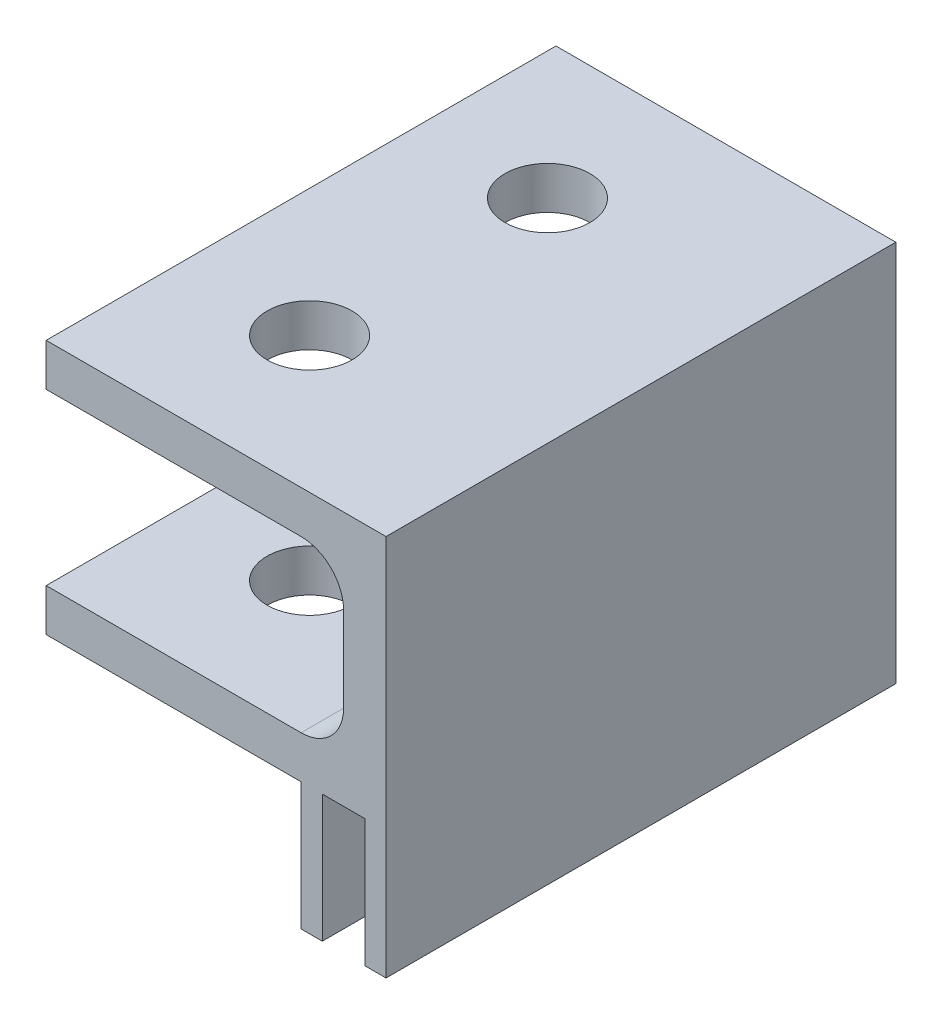
ISO-10303-21;
HEADER;
FILE_DESCRIPTION(('STEP AP214'),'2;1');
FILE_NAME('part.step','',(''),(''),'','','');
FILE_SCHEMA(('AUTOMOTIVE_DESIGN { 1 0 10303 214 1 1 1 1 }'));
ENDSEC;
DATA;
#1=APPLICATION_CONTEXT('core data for automotive mechanical design processes');
#2=APPLICATION_PROTOCOL_DEFINITION('international standard','automotive_design',2000,#1);
#3=PRODUCT_CONTEXT('',#1,'mechanical');
#4=PRODUCT('Part','Part','',(#3));
#5=PRODUCT_RELATED_PRODUCT_CATEGORY('part','',(#4));
#6=PRODUCT_DEFINITION_FORMATION('','',#4);
#7=PRODUCT_DEFINITION_CONTEXT('part definition',#1,'design');
#8=PRODUCT_DEFINITION('design','',#6,#7);
#9=PRODUCT_DEFINITION_SHAPE('','',#8);
#10=(LENGTH_UNIT() NAMED_UNIT(*) SI_UNIT(.MILLI.,.METRE.));
#11=(NAMED_UNIT(*) PLANE_ANGLE_UNIT() SI_UNIT($,.RADIAN.));
#12=(NAMED_UNIT(*) SI_UNIT($,.STERADIAN.) SOLID_ANGLE_UNIT());
#13=UNCERTAINTY_MEASURE_WITH_UNIT(LENGTH_MEASURE(1.E-05),#10,'distance_accuracy_value','');
#14=(GEOMETRIC_REPRESENTATION_CONTEXT(3) GLOBAL_UNCERTAINTY_ASSIGNED_CONTEXT((#13)) GLOBAL_UNIT_ASSIGNED_CONTEXT((#10,
#11,#12)) REPRESENTATION_CONTEXT('',''));
#15=CARTESIAN_POINT('',(0.,0.,0.));
#16=DIRECTION('',(0.,0.,1.));
#17=DIRECTION('',(1.,0.,0.));
#18=AXIS2_PLACEMENT_3D('',#15,#16,#17);
#19=CARTESIAN_POINT('',(0.,-25.,60.));
#20=DIRECTION('',(0.,1.,0.));
#21=DIRECTION('',(0.,0.,1.));
#22=AXIS2_PLACEMENT_3D('',#19,#20,#21);
#23=PLANE('',#22);
#24=DIRECTION('',(1.,0.,0.));
#25=VECTOR('',#24,1.);
#26=CARTESIAN_POINT('',(0.,-25.,0.));
#27=LINE('',#26,#25);
#28=CARTESIAN_POINT('',(32.5,-25.,0.));
#29=VERTEX_POINT('',#28);
#30=CARTESIAN_POINT('',(37.5,-25.,0.));
#31=VERTEX_POINT('',#30);
#32=EDGE_CURVE('E55',#29,#31,#27,.T.);
#33=ORIENTED_EDGE('',*,*,#32,.T.);
#34=DIRECTION('',(0.,0.,1.));
#35=VECTOR('',#34,1.);
#36=CARTESIAN_POINT('',(37.5,-25.,0.));
#37=LINE('',#36,#35);
#38=CARTESIAN_POINT('',(37.5,-25.,60.));
#39=VERTEX_POINT('',#38);
#40=EDGE_CURVE('E50',#31,#39,#37,.T.);
#41=ORIENTED_EDGE('',*,*,#40,.T.);
#42=DIRECTION('',(1.,0.,0.));
#43=VECTOR('',#42,1.);
#44=CARTESIAN_POINT('',(0.,-25.,60.));
#45=LINE('',#44,#43);
#46=CARTESIAN_POINT('',(32.5,-25.,60.));
#47=VERTEX_POINT('',#46);
#48=EDGE_CURVE('E240',#47,#39,#45,.T.);
#49=ORIENTED_EDGE('',*,*,#48,.F.);
#50=DIRECTION('',(0.,0.,1.));
#51=VECTOR('',#50,1.);
#52=CARTESIAN_POINT('',(32.5,-25.,0.));
#53=LINE('',#52,#51);
#54=EDGE_CURVE('E180',#29,#47,#53,.T.);
#55=ORIENTED_EDGE('',*,*,#54,.F.);
#56=EDGE_LOOP('',(#33,#41,#49,#55));
#57=FACE_BOUND('',#56,.T.);
#58=ADVANCED_FACE('F35',(#57),#23,.F.);
#59=CARTESIAN_POINT('',(0.,0.,60.));
#60=DIRECTION('',(0.,1.,0.));
#61=DIRECTION('',(0.,0.,1.));
#62=AXIS2_PLACEMENT_3D('',#59,#60,#61);
#63=PLANE('',#62);
#64=DIRECTION('',(1.,0.,0.));
#65=VECTOR('',#64,1.);
#66=CARTESIAN_POINT('',(0.,0.,0.));
#67=LINE('',#66,#65);
#68=CARTESIAN_POINT('',(0.,0.,0.));
#69=VERTEX_POINT('',#68);
#70=CARTESIAN_POINT('',(30.,0.,0.));
#71=VERTEX_POINT('',#70);
#72=EDGE_CURVE('E251',#69,#71,#67,.T.);
#73=ORIENTED_EDGE('',*,*,#72,.T.);
#74=DIRECTION('',(0.,0.,-1.));
#75=VECTOR('',#74,1.);
#76=CARTESIAN_POINT('',(30.,0.,60.));
#77=LINE('',#76,#75);
#78=CARTESIAN_POINT('',(30.,0.,60.));
#79=VERTEX_POINT('',#78);
#80=EDGE_CURVE('E287',#71,#79,#77,.F.);
#81=ORIENTED_EDGE('',*,*,#80,.T.);
#82=DIRECTION('',(1.,0.,0.));
#83=VECTOR('',#82,1.);
#84=CARTESIAN_POINT('',(0.,0.,60.));
#85=LINE('',#84,#83);
#86=CARTESIAN_POINT('',(0.,0.,60.));
#87=VERTEX_POINT('',#86);
#88=EDGE_CURVE('E229',#87,#79,#85,.T.);
#89=ORIENTED_EDGE('',*,*,#88,.F.);
#90=DIRECTION('',(0.,0.,-1.));
#91=VECTOR('',#90,1.);
#92=CARTESIAN_POINT('',(0.,0.,60.));
#93=LINE('',#92,#91);
#94=EDGE_CURVE('E276',#87,#69,#93,.T.);
#95=ORIENTED_EDGE('',*,*,#94,.T.);
#96=EDGE_LOOP('',(#73,#81,#89,#95));
#97=FACE_BOUND('',#96,.T.);
#98=CARTESIAN_POINT('',(15.,0.,16.));
#99=DIRECTION('',(0.,1.,0.));
#100=DIRECTION('',(0.,0.,1.));
#101=AXIS2_PLACEMENT_3D('',#98,#99,#100);
#102=CIRCLE('',#101,5.);
#103=CARTESIAN_POINT('',(15.,0.,21.));
#104=VERTEX_POINT('',#103);
#105=EDGE_CURVE('E213',#104,#104,#102,.F.);
#106=ORIENTED_EDGE('',*,*,#105,.F.);
#107=EDGE_LOOP('',(#106));
#108=FACE_BOUND('',#107,.T.);
#109=CARTESIAN_POINT('',(15.,0.,44.));
#110=DIRECTION('',(0.,1.,0.));
#111=DIRECTION('',(0.,0.,1.));
#112=AXIS2_PLACEMENT_3D('',#109,#110,#111);
#113=CIRCLE('',#112,5.);
#114=CARTESIAN_POINT('',(15.,0.,49.));
#115=VERTEX_POINT('',#114);
#116=EDGE_CURVE('E222',#115,#115,#113,.T.);
#117=ORIENTED_EDGE('',*,*,#116,.T.);
#118=EDGE_LOOP('',(#117));
#119=FACE_BOUND('',#118,.T.);
#120=ADVANCED_FACE('F297',(#97,#108,#119),#63,.F.);
#121=CARTESIAN_POINT('',(35.,-20.,60.));
#122=DIRECTION('',(0.,-1.,0.));
#123=DIRECTION('',(1.,0.,0.));
#124=AXIS2_PLACEMENT_3D('',#121,#122,#123);
#125=PLANE('',#124);
#126=DIRECTION('',(-1.,0.,0.));
#127=VECTOR('',#126,1.);
#128=CARTESIAN_POINT('',(35.,-20.,60.));
#129=LINE('',#128,#127);
#130=CARTESIAN_POINT('',(30.,-20.,60.));
#131=VERTEX_POINT('',#130);
#132=CARTESIAN_POINT('',(0.,-20.,60.));
#133=VERTEX_POINT('',#132);
#134=EDGE_CURVE('E236',#131,#133,#129,.T.);
#135=ORIENTED_EDGE('',*,*,#134,.F.);
#136=DIRECTION('',(0.,0.,-1.));
#137=VECTOR('',#136,1.);
#138=CARTESIAN_POINT('',(30.,-20.,0.));
#139=LINE('',#138,#137);
#140=CARTESIAN_POINT('',(30.,-20.,0.));
#141=VERTEX_POINT('',#140);
#142=EDGE_CURVE('E279',#131,#141,#139,.T.);
#143=ORIENTED_EDGE('',*,*,#142,.T.);
#144=DIRECTION('',(-1.,0.,0.));
#145=VECTOR('',#144,1.);
#146=CARTESIAN_POINT('',(35.,-20.,0.));
#147=LINE('',#146,#145);
#148=CARTESIAN_POINT('',(0.,-20.,0.));
#149=VERTEX_POINT('',#148);
#150=EDGE_CURVE('E257',#141,#149,#147,.T.);
#151=ORIENTED_EDGE('',*,*,#150,.T.);
#152=DIRECTION('',(0.,0.,-1.));
#153=VECTOR('',#152,1.);
#154=CARTESIAN_POINT('',(0.,-20.,60.));
#155=LINE('',#154,#153);
#156=EDGE_CURVE('E273',#133,#149,#155,.T.);
#157=ORIENTED_EDGE('',*,*,#156,.F.);
#158=EDGE_LOOP('',(#135,#143,#151,#157));
#159=FACE_BOUND('',#158,.T.);
#160=CARTESIAN_POINT('',(15.,-20.,16.));
#161=DIRECTION('',(0.,-1.,0.));
#162=DIRECTION('',(1.,0.,0.));
#163=AXIS2_PLACEMENT_3D('',#160,#161,#162);
#164=CIRCLE('',#163,5.);
#165=CARTESIAN_POINT('',(20.,-20.,16.));
#166=VERTEX_POINT('',#165);
#167=EDGE_CURVE('E210',#166,#166,#164,.F.);
#168=ORIENTED_EDGE('',*,*,#167,.F.);
#169=EDGE_LOOP('',(#168));
#170=FACE_BOUND('',#169,.T.);
#171=CARTESIAN_POINT('',(15.,-20.,44.));
#172=DIRECTION('',(0.,-1.,0.));
#173=DIRECTION('',(1.,0.,0.));
#174=AXIS2_PLACEMENT_3D('',#171,#172,#173);
#175=CIRCLE('',#174,5.);
#176=CARTESIAN_POINT('',(20.,-20.,44.));
#177=VERTEX_POINT('',#176);
#178=EDGE_CURVE('E219',#177,#177,#175,.T.);
#179=ORIENTED_EDGE('',*,*,#178,.T.);
#180=EDGE_LOOP('',(#179));
#181=FACE_BOUND('',#180,.T.);
#182=ADVANCED_FACE('F314',(#159,#170,#181),#125,.F.);
#183=CARTESIAN_POINT('',(0.,-25.,0.));
#184=VERTEX_POINT('',#183);
#185=CARTESIAN_POINT('',(30.,-25.,0.));
#186=VERTEX_POINT('',#185);
#187=EDGE_CURVE('E261',#184,#186,#27,.T.);
#188=ORIENTED_EDGE('',*,*,#187,.T.);
#189=DIRECTION('',(0.,0.,1.));
#190=VECTOR('',#189,1.);
#191=CARTESIAN_POINT('',(30.,-25.,0.));
#192=LINE('',#191,#190);
#193=CARTESIAN_POINT('',(30.,-25.,60.));
#194=VERTEX_POINT('',#193);
#195=EDGE_CURVE('E152',#186,#194,#192,.T.);
#196=ORIENTED_EDGE('',*,*,#195,.T.);
#197=CARTESIAN_POINT('',(0.,-25.,60.));
#198=VERTEX_POINT('',#197);
#199=EDGE_CURVE('E241',#198,#194,#45,.T.);
#200=ORIENTED_EDGE('',*,*,#199,.F.);
#201=DIRECTION('',(0.,0.,-1.));
#202=VECTOR('',#201,1.);
#203=CARTESIAN_POINT('',(0.,-25.,60.));
#204=LINE('',#203,#202);
#205=EDGE_CURVE('E270',#198,#184,#204,.T.);
#206=ORIENTED_EDGE('',*,*,#205,.T.);
#207=EDGE_LOOP('',(#188,#196,#200,#206));
#208=FACE_BOUND('',#207,.T.);
#209=CARTESIAN_POINT('',(15.,-25.,16.));
#210=DIRECTION('',(0.,1.,0.));
#211=DIRECTION('',(0.,0.,1.));
#212=AXIS2_PLACEMENT_3D('',#209,#210,#211);
#213=CIRCLE('',#212,5.);
#214=CARTESIAN_POINT('',(15.,-25.,21.));
#215=VERTEX_POINT('',#214);
#216=EDGE_CURVE('E205',#215,#215,#213,.F.);
#217=ORIENTED_EDGE('',*,*,#216,.F.);
#218=EDGE_LOOP('',(#217));
#219=FACE_BOUND('',#218,.T.);
#220=CARTESIAN_POINT('',(15.,-25.,44.));
#221=DIRECTION('',(0.,1.,0.));
#222=DIRECTION('',(0.,0.,1.));
#223=AXIS2_PLACEMENT_3D('',#220,#221,#222);
#224=CIRCLE('',#223,5.);
#225=CARTESIAN_POINT('',(15.,-25.,49.));
#226=VERTEX_POINT('',#225);
#227=EDGE_CURVE('E216',#226,#226,#224,.T.);
#228=ORIENTED_EDGE('',*,*,#227,.T.);
#229=EDGE_LOOP('',(#228));
#230=FACE_BOUND('',#229,.T.);
#231=ADVANCED_FACE('F339',(#208,#219,#230),#23,.F.);
#232=CARTESIAN_POINT('',(40.,5.00000000000001,60.));
#233=DIRECTION('',(0.,-1.,0.));
#234=DIRECTION('',(1.,0.,0.));
#235=AXIS2_PLACEMENT_3D('',#232,#233,#234);
#236=PLANE('',#235);
#237=DIRECTION('',(-1.,0.,0.));
#238=VECTOR('',#237,1.);
#239=CARTESIAN_POINT('',(40.,5.00000000000001,0.));
#240=LINE('',#239,#238);
#241=CARTESIAN_POINT('',(40.,5.00000000000001,0.));
#242=VERTEX_POINT('',#241);
#243=CARTESIAN_POINT('',(0.,5.,0.));
#244=VERTEX_POINT('',#243);
#245=EDGE_CURVE('E230',#242,#244,#240,.T.);
#246=ORIENTED_EDGE('',*,*,#245,.T.);
#247=DIRECTION('',(0.,0.,-1.));
#248=VECTOR('',#247,1.);
#249=CARTESIAN_POINT('',(0.,5.,60.));
#250=LINE('',#249,#248);
#251=CARTESIAN_POINT('',(0.,5.,60.));
#252=VERTEX_POINT('',#251);
#253=EDGE_CURVE('E248',#252,#244,#250,.T.);
#254=ORIENTED_EDGE('',*,*,#253,.F.);
#255=DIRECTION('',(-1.,0.,0.));
#256=VECTOR('',#255,1.);
#257=CARTESIAN_POINT('',(40.,5.00000000000001,60.));
#258=LINE('',#257,#256);
#259=CARTESIAN_POINT('',(40.,5.00000000000001,60.));
#260=VERTEX_POINT('',#259);
#261=EDGE_CURVE('E246',#260,#252,#258,.T.);
#262=ORIENTED_EDGE('',*,*,#261,.F.);
#263=DIRECTION('',(0.,0.,-1.));
#264=VECTOR('',#263,1.);
#265=CARTESIAN_POINT('',(40.,5.00000000000001,60.));
#266=LINE('',#265,#264);
#267=EDGE_CURVE('E267',#260,#242,#266,.T.);
#268=ORIENTED_EDGE('',*,*,#267,.T.);
#269=EDGE_LOOP('',(#246,#254,#262,#268));
#270=FACE_BOUND('',#269,.T.);
#271=CARTESIAN_POINT('',(15.,5.,16.));
#272=DIRECTION('',(0.,-1.,0.));
#273=DIRECTION('',(1.,0.,0.));
#274=AXIS2_PLACEMENT_3D('',#271,#272,#273);
#275=CIRCLE('',#274,5.);
#276=CARTESIAN_POINT('',(20.,5.,16.));
#277=VERTEX_POINT('',#276);
#278=EDGE_CURVE('E201',#277,#277,#275,.T.);
#279=ORIENTED_EDGE('',*,*,#278,.T.);
#280=EDGE_LOOP('',(#279));
#281=FACE_BOUND('',#280,.T.);
#282=CARTESIAN_POINT('',(15.,5.,44.));
#283=DIRECTION('',(0.,1.,0.));
#284=DIRECTION('',(-1.,0.,0.));
#285=AXIS2_PLACEMENT_3D('',#282,#283,#284);
#286=CIRCLE('',#285,5.);
#287=CARTESIAN_POINT('',(10.,5.,44.));
#288=VERTEX_POINT('',#287);
#289=EDGE_CURVE('E202',#288,#288,#286,.T.);
#290=ORIENTED_EDGE('',*,*,#289,.F.);
#291=EDGE_LOOP('',(#290));
#292=FACE_BOUND('',#291,.T.);
#293=ADVANCED_FACE('F342',(#270,#281,#292),#236,.F.);
#294=CARTESIAN_POINT('',(0.,5.,60.));
#295=DIRECTION('',(1.,0.,0.));
#296=DIRECTION('',(0.,0.,-1.));
#297=AXIS2_PLACEMENT_3D('',#294,#295,#296);
#298=PLANE('',#297);
#299=DIRECTION('',(0.,-1.,0.));
#300=VECTOR('',#299,1.);
#301=CARTESIAN_POINT('',(0.,5.,0.));
#302=LINE('',#301,#300);
#303=EDGE_CURVE('E225',#244,#69,#302,.T.);
#304=ORIENTED_EDGE('',*,*,#303,.T.);
#305=ORIENTED_EDGE('',*,*,#94,.F.);
#306=DIRECTION('',(0.,-1.,0.));
#307=VECTOR('',#306,1.);
#308=CARTESIAN_POINT('',(0.,5.,60.));
#309=LINE('',#308,#307);
#310=EDGE_CURVE('E226',#252,#87,#309,.T.);
#311=ORIENTED_EDGE('',*,*,#310,.F.);
#312=ORIENTED_EDGE('',*,*,#253,.T.);
#313=EDGE_LOOP('',(#304,#305,#311,#312));
#314=FACE_BOUND('',#313,.T.);
#315=ADVANCED_FACE('F376',(#314),#298,.F.);
#316=CARTESIAN_POINT('',(35.,0.,60.));
#317=DIRECTION('',(1.,0.,0.));
#318=DIRECTION('',(0.,1.,0.));
#319=AXIS2_PLACEMENT_3D('',#316,#317,#318);
#320=PLANE('',#319);
#321=DIRECTION('',(0.,-1.,0.));
#322=VECTOR('',#321,1.);
#323=CARTESIAN_POINT('',(35.,0.,0.));
#324=LINE('',#323,#322);
#325=CARTESIAN_POINT('',(35.,-5.,0.));
#326=VERTEX_POINT('',#325);
#327=CARTESIAN_POINT('',(35.,-15.,0.));
#328=VERTEX_POINT('',#327);
#329=EDGE_CURVE('E254',#326,#328,#324,.T.);
#330=ORIENTED_EDGE('',*,*,#329,.T.);
#331=DIRECTION('',(0.,0.,-1.));
#332=VECTOR('',#331,1.);
#333=CARTESIAN_POINT('',(35.,-15.,60.));
#334=LINE('',#333,#332);
#335=CARTESIAN_POINT('',(35.,-15.,60.));
#336=VERTEX_POINT('',#335);
#337=EDGE_CURVE('E285',#328,#336,#334,.F.);
#338=ORIENTED_EDGE('',*,*,#337,.T.);
#339=DIRECTION('',(0.,-1.,0.));
#340=VECTOR('',#339,1.);
#341=CARTESIAN_POINT('',(35.,0.,60.));
#342=LINE('',#341,#340);
#343=CARTESIAN_POINT('',(35.,-5.,60.));
#344=VERTEX_POINT('',#343);
#345=EDGE_CURVE('E233',#344,#336,#342,.T.);
#346=ORIENTED_EDGE('',*,*,#345,.F.);
#347=DIRECTION('',(0.,0.,-1.));
#348=VECTOR('',#347,1.);
#349=CARTESIAN_POINT('',(35.,-5.,0.));
#350=LINE('',#349,#348);
#351=EDGE_CURVE('E282',#344,#326,#350,.T.);
#352=ORIENTED_EDGE('',*,*,#351,.T.);
#353=EDGE_LOOP('',(#330,#338,#346,#352));
#354=FACE_BOUND('',#353,.T.);
#355=ADVANCED_FACE('F306',(#354),#320,.F.);
#356=CARTESIAN_POINT('',(0.,-20.,60.));
#357=DIRECTION('',(1.,0.,0.));
#358=DIRECTION('',(0.,1.,0.));
#359=AXIS2_PLACEMENT_3D('',#356,#357,#358);
#360=PLANE('',#359);
#361=DIRECTION('',(0.,-1.,0.));
#362=VECTOR('',#361,1.);
#363=CARTESIAN_POINT('',(0.,-20.,0.));
#364=LINE('',#363,#362);
#365=EDGE_CURVE('E259',#149,#184,#364,.T.);
#366=ORIENTED_EDGE('',*,*,#365,.T.);
#367=ORIENTED_EDGE('',*,*,#205,.F.);
#368=DIRECTION('',(0.,-1.,0.));
#369=VECTOR('',#368,1.);
#370=CARTESIAN_POINT('',(0.,-20.,60.));
#371=LINE('',#370,#369);
#372=EDGE_CURVE('E238',#133,#198,#371,.T.);
#373=ORIENTED_EDGE('',*,*,#372,.F.);
#374=ORIENTED_EDGE('',*,*,#156,.T.);
#375=EDGE_LOOP('',(#366,#367,#373,#374));
#376=FACE_BOUND('',#375,.T.);
#377=ADVANCED_FACE('F321',(#376),#360,.F.);
#378=CARTESIAN_POINT('',(40.,-25.,60.));
#379=DIRECTION('',(-1.,0.,0.));
#380=DIRECTION('',(0.,0.,1.));
#381=AXIS2_PLACEMENT_3D('',#378,#379,#380);
#382=PLANE('',#381);
#383=DIRECTION('',(0.,1.,0.));
#384=VECTOR('',#383,1.);
#385=CARTESIAN_POINT('',(40.,-25.,0.));
#386=LINE('',#385,#384);
#387=CARTESIAN_POINT('',(40.,-40.,0.));
#388=VERTEX_POINT('',#387);
#389=EDGE_CURVE('E160',#388,#242,#386,.T.);
#390=ORIENTED_EDGE('',*,*,#389,.T.);
#391=ORIENTED_EDGE('',*,*,#267,.F.);
#392=DIRECTION('',(0.,1.,0.));
#393=VECTOR('',#392,1.);
#394=CARTESIAN_POINT('',(40.,-25.,60.));
#395=LINE('',#394,#393);
#396=CARTESIAN_POINT('',(40.,-40.,60.));
#397=VERTEX_POINT('',#396);
#398=EDGE_CURVE('E244',#397,#260,#395,.T.);
#399=ORIENTED_EDGE('',*,*,#398,.F.);
#400=DIRECTION('',(0.,0.,1.));
#401=VECTOR('',#400,1.);
#402=CARTESIAN_POINT('',(40.,-40.,0.));
#403=LINE('',#402,#401);
#404=EDGE_CURVE('E164',#388,#397,#403,.T.);
#405=ORIENTED_EDGE('',*,*,#404,.F.);
#406=EDGE_LOOP('',(#390,#391,#399,#405));
#407=FACE_BOUND('',#406,.T.);
#408=ADVANCED_FACE('F368',(#407),#382,.F.);
#409=CARTESIAN_POINT('',(0.,0.,60.));
#410=DIRECTION('',(0.,0.,1.));
#411=DIRECTION('',(1.,0.,0.));
#412=AXIS2_PLACEMENT_3D('',#409,#410,#411);
#413=PLANE('',#412);
#414=ORIENTED_EDGE('',*,*,#310,.T.);
#415=ORIENTED_EDGE('',*,*,#88,.T.);
#416=CARTESIAN_POINT('',(30.,-5.,60.));
#417=DIRECTION('',(0.,0.,1.));
#418=DIRECTION('',(1.,0.,0.));
#419=AXIS2_PLACEMENT_3D('',#416,#417,#418);
#420=CIRCLE('',#419,5.);
#421=EDGE_CURVE('E11',#79,#344,#420,.F.);
#422=ORIENTED_EDGE('',*,*,#421,.T.);
#423=ORIENTED_EDGE('',*,*,#345,.T.);
#424=CARTESIAN_POINT('',(30.,-15.,60.));
#425=DIRECTION('',(0.,0.,1.));
#426=DIRECTION('',(1.,0.,0.));
#427=AXIS2_PLACEMENT_3D('',#424,#425,#426);
#428=CIRCLE('',#427,5.);
#429=EDGE_CURVE('E291',#336,#131,#428,.F.);
#430=ORIENTED_EDGE('',*,*,#429,.T.);
#431=ORIENTED_EDGE('',*,*,#134,.T.);
#432=ORIENTED_EDGE('',*,*,#372,.T.);
#433=ORIENTED_EDGE('',*,*,#199,.T.);
#434=DIRECTION('',(0.,1.,0.));
#435=VECTOR('',#434,1.);
#436=CARTESIAN_POINT('',(30.,-40.,60.));
#437=LINE('',#436,#435);
#438=CARTESIAN_POINT('',(30.,-40.,60.));
#439=VERTEX_POINT('',#438);
#440=EDGE_CURVE('E186',#439,#194,#437,.T.);
#441=ORIENTED_EDGE('',*,*,#440,.F.);
#442=DIRECTION('',(-1.,0.,0.));
#443=VECTOR('',#442,1.);
#444=CARTESIAN_POINT('',(0.,-40.,60.));
#445=LINE('',#444,#443);
#446=CARTESIAN_POINT('',(32.5,-40.,60.));
#447=VERTEX_POINT('',#446);
#448=EDGE_CURVE('E184',#447,#439,#445,.T.);
#449=ORIENTED_EDGE('',*,*,#448,.F.);
#450=DIRECTION('',(0.,1.,0.));
#451=VECTOR('',#450,1.);
#452=CARTESIAN_POINT('',(32.5,-40.,60.));
#453=LINE('',#452,#451);
#454=EDGE_CURVE('E192',#447,#47,#453,.T.);
#455=ORIENTED_EDGE('',*,*,#454,.T.);
#456=ORIENTED_EDGE('',*,*,#48,.T.);
#457=DIRECTION('',(0.,1.,0.));
#458=VECTOR('',#457,1.);
#459=CARTESIAN_POINT('',(37.5,-40.,60.));
#460=LINE('',#459,#458);
#461=CARTESIAN_POINT('',(37.5,-40.,60.));
#462=VERTEX_POINT('',#461);
#463=EDGE_CURVE('E153',#462,#39,#460,.T.);
#464=ORIENTED_EDGE('',*,*,#463,.F.);
#465=DIRECTION('',(-1.,0.,0.));
#466=VECTOR('',#465,1.);
#467=CARTESIAN_POINT('',(0.,-40.,60.));
#468=LINE('',#467,#466);
#469=EDGE_CURVE('E168',#397,#462,#468,.T.);
#470=ORIENTED_EDGE('',*,*,#469,.F.);
#471=ORIENTED_EDGE('',*,*,#398,.T.);
#472=ORIENTED_EDGE('',*,*,#261,.T.);
#473=EDGE_LOOP('',(#414,#415,#422,#423,#430,#431,#432,#433,#441,#449,#455,#456,#464,#470,#471,#472));
#474=FACE_BOUND('',#473,.T.);
#475=ADVANCED_FACE('F303',(#474),#413,.T.);
#476=CARTESIAN_POINT('',(0.,0.,0.));
#477=DIRECTION('',(0.,0.,1.));
#478=DIRECTION('',(1.,0.,0.));
#479=AXIS2_PLACEMENT_3D('',#476,#477,#478);
#480=PLANE('',#479);
#481=ORIENTED_EDGE('',*,*,#303,.F.);
#482=ORIENTED_EDGE('',*,*,#245,.F.);
#483=ORIENTED_EDGE('',*,*,#389,.F.);
#484=DIRECTION('',(1.,0.,0.));
#485=VECTOR('',#484,1.);
#486=CARTESIAN_POINT('',(0.,-40.,0.));
#487=LINE('',#486,#485);
#488=CARTESIAN_POINT('',(37.5,-40.,0.));
#489=VERTEX_POINT('',#488);
#490=EDGE_CURVE('E156',#489,#388,#487,.T.);
#491=ORIENTED_EDGE('',*,*,#490,.F.);
#492=DIRECTION('',(0.,1.,0.));
#493=VECTOR('',#492,1.);
#494=CARTESIAN_POINT('',(37.5,-40.,0.));
#495=LINE('',#494,#493);
#496=EDGE_CURVE('E145',#489,#31,#495,.T.);
#497=ORIENTED_EDGE('',*,*,#496,.T.);
#498=ORIENTED_EDGE('',*,*,#32,.F.);
#499=DIRECTION('',(0.,1.,0.));
#500=VECTOR('',#499,1.);
#501=CARTESIAN_POINT('',(32.5,-40.,0.));
#502=LINE('',#501,#500);
#503=CARTESIAN_POINT('',(32.5,-40.,0.));
#504=VERTEX_POINT('',#503);
#505=EDGE_CURVE('E195',#504,#29,#502,.T.);
#506=ORIENTED_EDGE('',*,*,#505,.F.);
#507=DIRECTION('',(1.,0.,0.));
#508=VECTOR('',#507,1.);
#509=CARTESIAN_POINT('',(0.,-40.,0.));
#510=LINE('',#509,#508);
#511=CARTESIAN_POINT('',(30.,-40.,0.));
#512=VERTEX_POINT('',#511);
#513=EDGE_CURVE('E179',#512,#504,#510,.T.);
#514=ORIENTED_EDGE('',*,*,#513,.F.);
#515=DIRECTION('',(0.,1.,0.));
#516=VECTOR('',#515,1.);
#517=CARTESIAN_POINT('',(30.,-40.,0.));
#518=LINE('',#517,#516);
#519=EDGE_CURVE('E198',#512,#186,#518,.T.);
#520=ORIENTED_EDGE('',*,*,#519,.T.);
#521=ORIENTED_EDGE('',*,*,#187,.F.);
#522=ORIENTED_EDGE('',*,*,#365,.F.);
#523=ORIENTED_EDGE('',*,*,#150,.F.);
#524=CARTESIAN_POINT('',(30.,-15.,0.));
#525=DIRECTION('',(0.,0.,1.));
#526=DIRECTION('',(1.,0.,0.));
#527=AXIS2_PLACEMENT_3D('',#524,#525,#526);
#528=CIRCLE('',#527,5.);
#529=EDGE_CURVE('E289',#141,#328,#528,.T.);
#530=ORIENTED_EDGE('',*,*,#529,.T.);
#531=ORIENTED_EDGE('',*,*,#329,.F.);
#532=CARTESIAN_POINT('',(30.,-5.,0.));
#533=DIRECTION('',(0.,0.,1.));
#534=DIRECTION('',(1.,0.,0.));
#535=AXIS2_PLACEMENT_3D('',#532,#533,#534);
#536=CIRCLE('',#535,5.);
#537=EDGE_CURVE('E43',#326,#71,#536,.T.);
#538=ORIENTED_EDGE('',*,*,#537,.T.);
#539=ORIENTED_EDGE('',*,*,#72,.F.);
#540=EDGE_LOOP('',(#481,#482,#483,#491,#497,#498,#506,#514,#520,#521,#522,#523,#530,#531,#538,#539));
#541=FACE_BOUND('',#540,.T.);
#542=ADVANCED_FACE('F158',(#541),#480,.F.);
#543=CARTESIAN_POINT('',(30.,-15.,60.));
#544=DIRECTION('',(0.,0.,1.));
#545=DIRECTION('',(1.,0.,0.));
#546=AXIS2_PLACEMENT_3D('',#543,#544,#545);
#547=CYLINDRICAL_SURFACE('',#546,5.);
#548=ORIENTED_EDGE('',*,*,#429,.F.);
#549=ORIENTED_EDGE('',*,*,#337,.F.);
#550=ORIENTED_EDGE('',*,*,#529,.F.);
#551=ORIENTED_EDGE('',*,*,#142,.F.);
#552=EDGE_LOOP('',(#548,#549,#550,#551));
#553=FACE_BOUND('',#552,.T.);
#554=ADVANCED_FACE('F309',(#553),#547,.F.);
#555=CARTESIAN_POINT('',(30.,-5.,60.));
#556=DIRECTION('',(0.,0.,1.));
#557=DIRECTION('',(1.,0.,0.));
#558=AXIS2_PLACEMENT_3D('',#555,#556,#557);
#559=CYLINDRICAL_SURFACE('',#558,5.);
#560=ORIENTED_EDGE('',*,*,#421,.F.);
#561=ORIENTED_EDGE('',*,*,#80,.F.);
#562=ORIENTED_EDGE('',*,*,#537,.F.);
#563=ORIENTED_EDGE('',*,*,#351,.F.);
#564=EDGE_LOOP('',(#560,#561,#562,#563));
#565=FACE_BOUND('',#564,.T.);
#566=ADVANCED_FACE('F37',(#565),#559,.F.);
#567=CARTESIAN_POINT('',(15.,-70.,16.));
#568=DIRECTION('',(0.,1.,0.));
#569=DIRECTION('',(-1.,0.,0.));
#570=AXIS2_PLACEMENT_3D('',#567,#568,#569);
#571=CYLINDRICAL_SURFACE('',#570,5.);
#572=ORIENTED_EDGE('',*,*,#278,.F.);
#573=EDGE_LOOP('',(#572));
#574=FACE_BOUND('',#573,.T.);
#575=ORIENTED_EDGE('',*,*,#105,.T.);
#576=EDGE_LOOP('',(#575));
#577=FACE_BOUND('',#576,.T.);
#578=ADVANCED_FACE('F387',(#574,#577),#571,.F.);
#579=CARTESIAN_POINT('',(15.,-70.,44.));
#580=DIRECTION('',(0.,1.,0.));
#581=DIRECTION('',(-1.,0.,0.));
#582=AXIS2_PLACEMENT_3D('',#579,#580,#581);
#583=CYLINDRICAL_SURFACE('',#582,5.);
#584=ORIENTED_EDGE('',*,*,#289,.T.);
#585=EDGE_LOOP('',(#584));
#586=FACE_BOUND('',#585,.T.);
#587=ORIENTED_EDGE('',*,*,#116,.F.);
#588=EDGE_LOOP('',(#587));
#589=FACE_BOUND('',#588,.T.);
#590=ADVANCED_FACE('F353',(#586,#589),#583,.F.);
#591=ORIENTED_EDGE('',*,*,#216,.T.);
#592=EDGE_LOOP('',(#591));
#593=FACE_BOUND('',#592,.T.);
#594=ORIENTED_EDGE('',*,*,#167,.T.);
#595=EDGE_LOOP('',(#594));
#596=FACE_BOUND('',#595,.T.);
#597=ADVANCED_FACE('F351',(#593,#596),#571,.F.);
#598=ORIENTED_EDGE('',*,*,#227,.F.);
#599=EDGE_LOOP('',(#598));
#600=FACE_BOUND('',#599,.T.);
#601=ORIENTED_EDGE('',*,*,#178,.F.);
#602=EDGE_LOOP('',(#601));
#603=FACE_BOUND('',#602,.T.);
#604=ADVANCED_FACE('F348',(#600,#603),#583,.F.);
#605=CARTESIAN_POINT('',(30.,-40.,0.));
#606=DIRECTION('',(-1.,0.,0.));
#607=DIRECTION('',(0.,0.,1.));
#608=AXIS2_PLACEMENT_3D('',#605,#606,#607);
#609=PLANE('',#608);
#610=ORIENTED_EDGE('',*,*,#195,.F.);
#611=ORIENTED_EDGE('',*,*,#519,.F.);
#612=DIRECTION('',(0.,0.,1.));
#613=VECTOR('',#612,1.);
#614=CARTESIAN_POINT('',(30.,-40.,0.));
#615=LINE('',#614,#613);
#616=EDGE_CURVE('E176',#512,#439,#615,.T.);
#617=ORIENTED_EDGE('',*,*,#616,.T.);
#618=ORIENTED_EDGE('',*,*,#440,.T.);
#619=EDGE_LOOP('',(#610,#611,#617,#618));
#620=FACE_BOUND('',#619,.T.);
#621=ADVANCED_FACE('F328',(#620),#609,.T.);
#622=CARTESIAN_POINT('',(32.5,-40.,0.));
#623=DIRECTION('',(-1.,0.,0.));
#624=DIRECTION('',(0.,0.,1.));
#625=AXIS2_PLACEMENT_3D('',#622,#623,#624);
#626=PLANE('',#625);
#627=ORIENTED_EDGE('',*,*,#54,.T.);
#628=ORIENTED_EDGE('',*,*,#454,.F.);
#629=DIRECTION('',(0.,0.,1.));
#630=VECTOR('',#629,1.);
#631=CARTESIAN_POINT('',(32.5,-40.,0.));
#632=LINE('',#631,#630);
#633=EDGE_CURVE('E182',#504,#447,#632,.T.);
#634=ORIENTED_EDGE('',*,*,#633,.F.);
#635=ORIENTED_EDGE('',*,*,#505,.T.);
#636=EDGE_LOOP('',(#627,#628,#634,#635));
#637=FACE_BOUND('',#636,.T.);
#638=ADVANCED_FACE('F337',(#637),#626,.F.);
#639=CARTESIAN_POINT('',(0.,-40.,0.));
#640=DIRECTION('',(0.,-1.,0.));
#641=DIRECTION('',(0.,0.,-1.));
#642=AXIS2_PLACEMENT_3D('',#639,#640,#641);
#643=PLANE('',#642);
#644=ORIENTED_EDGE('',*,*,#616,.F.);
#645=ORIENTED_EDGE('',*,*,#513,.T.);
#646=ORIENTED_EDGE('',*,*,#633,.T.);
#647=ORIENTED_EDGE('',*,*,#448,.T.);
#648=EDGE_LOOP('',(#644,#645,#646,#647));
#649=FACE_BOUND('',#648,.T.);
#650=ADVANCED_FACE('F332',(#649),#643,.T.);
#651=CARTESIAN_POINT('',(37.5,-40.,0.));
#652=DIRECTION('',(-1.,0.,0.));
#653=DIRECTION('',(0.,0.,1.));
#654=AXIS2_PLACEMENT_3D('',#651,#652,#653);
#655=PLANE('',#654);
#656=ORIENTED_EDGE('',*,*,#40,.F.);
#657=ORIENTED_EDGE('',*,*,#496,.F.);
#658=DIRECTION('',(0.,0.,1.));
#659=VECTOR('',#658,1.);
#660=CARTESIAN_POINT('',(37.5,-40.,0.));
#661=LINE('',#660,#659);
#662=EDGE_CURVE('E150',#489,#462,#661,.T.);
#663=ORIENTED_EDGE('',*,*,#662,.T.);
#664=ORIENTED_EDGE('',*,*,#463,.T.);
#665=EDGE_LOOP('',(#656,#657,#663,#664));
#666=FACE_BOUND('',#665,.T.);
#667=ADVANCED_FACE('F147',(#666),#655,.T.);
#668=CARTESIAN_POINT('',(0.,-40.,0.));
#669=DIRECTION('',(0.,-1.,0.));
#670=DIRECTION('',(0.,0.,-1.));
#671=AXIS2_PLACEMENT_3D('',#668,#669,#670);
#672=PLANE('',#671);
#673=ORIENTED_EDGE('',*,*,#662,.F.);
#674=ORIENTED_EDGE('',*,*,#490,.T.);
#675=ORIENTED_EDGE('',*,*,#404,.T.);
#676=ORIENTED_EDGE('',*,*,#469,.T.);
#677=EDGE_LOOP('',(#673,#674,#675,#676));
#678=FACE_BOUND('',#677,.T.);
#679=ADVANCED_FACE('F166',(#678),#672,.T.);
#680=CLOSED_SHELL('',(#58,#120,#182,#231,#293,#315,#355,#377,#408,#475,#542,#554,#566,#578,#590,
#597,#604,#621,#638,#650,#667,#679));
#681=MANIFOLD_SOLID_BREP('B2',#680);
#682=ADVANCED_BREP_SHAPE_REPRESENTATION('',(#18,#681),#14);
#683=SHAPE_DEFINITION_REPRESENTATION(#9,#682);
ENDSEC;
END-ISO-10303-21;
